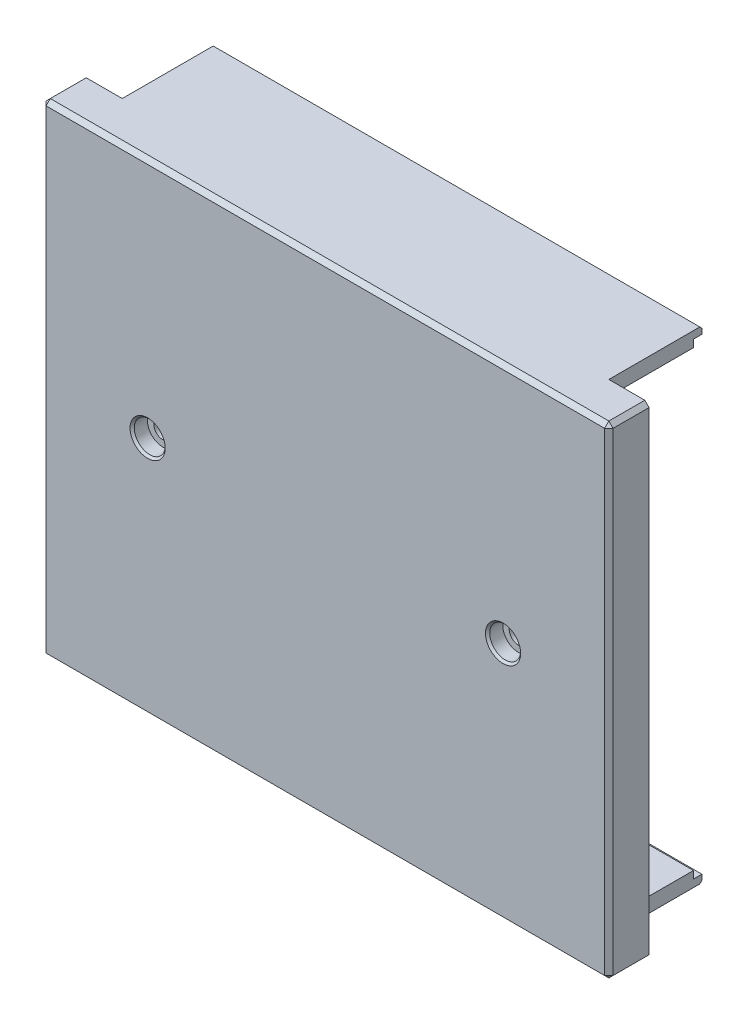
ISO-10303-21;
HEADER;
FILE_DESCRIPTION(('STEP AP214'),'2;1');
FILE_NAME('part.step','',(''),(''),'','','');
FILE_SCHEMA(('AUTOMOTIVE_DESIGN { 1 0 10303 214 1 1 1 1 }'));
ENDSEC;
DATA;
#1=APPLICATION_CONTEXT('core data for automotive mechanical design processes');
#2=APPLICATION_PROTOCOL_DEFINITION('international standard','automotive_design',2000,#1);
#3=PRODUCT_CONTEXT('',#1,'mechanical');
#4=PRODUCT('Part','Part','',(#3));
#5=PRODUCT_RELATED_PRODUCT_CATEGORY('part','',(#4));
#6=PRODUCT_DEFINITION_FORMATION('','',#4);
#7=PRODUCT_DEFINITION_CONTEXT('part definition',#1,'design');
#8=PRODUCT_DEFINITION('design','',#6,#7);
#9=PRODUCT_DEFINITION_SHAPE('','',#8);
#10=(LENGTH_UNIT() NAMED_UNIT(*) SI_UNIT(.MILLI.,.METRE.));
#11=(NAMED_UNIT(*) PLANE_ANGLE_UNIT() SI_UNIT($,.RADIAN.));
#12=(NAMED_UNIT(*) SI_UNIT($,.STERADIAN.) SOLID_ANGLE_UNIT());
#13=UNCERTAINTY_MEASURE_WITH_UNIT(LENGTH_MEASURE(1.E-05),#10,'distance_accuracy_value','');
#14=(GEOMETRIC_REPRESENTATION_CONTEXT(3) GLOBAL_UNCERTAINTY_ASSIGNED_CONTEXT((#13)) GLOBAL_UNIT_ASSIGNED_CONTEXT((#10,
#11,#12)) REPRESENTATION_CONTEXT('',''));
#15=CARTESIAN_POINT('',(0.,0.,0.));
#16=DIRECTION('',(0.,0.,1.));
#17=DIRECTION('',(1.,0.,0.));
#18=AXIS2_PLACEMENT_3D('',#15,#16,#17);
#19=CARTESIAN_POINT('',(0.,0.,-20.));
#20=DIRECTION('',(0.,0.,1.));
#21=DIRECTION('',(1.,0.,0.));
#22=AXIS2_PLACEMENT_3D('',#19,#20,#21);
#23=PLANE('',#22);
#24=DIRECTION('',(1.,0.,0.));
#25=VECTOR('',#24,1.);
#26=CARTESIAN_POINT('',(124.5,1.74999999999998,-20.));
#27=LINE('',#26,#25);
#28=CARTESIAN_POINT('',(9.50000000000001,1.74999999999998,-20.));
#29=VERTEX_POINT('',#28);
#30=CARTESIAN_POINT('',(124.5,1.74999999999998,-20.));
#31=VERTEX_POINT('',#30);
#32=EDGE_CURVE('E222',#29,#31,#27,.T.);
#33=ORIENTED_EDGE('',*,*,#32,.F.);
#34=DIRECTION('',(0.,1.,0.));
#35=VECTOR('',#34,1.);
#36=CARTESIAN_POINT('',(9.50000000000001,0.,-20.));
#37=LINE('',#36,#35);
#38=CARTESIAN_POINT('',(9.50000000000001,3.49999999999998,-20.));
#39=VERTEX_POINT('',#38);
#40=EDGE_CURVE('E209',#29,#39,#37,.T.);
#41=ORIENTED_EDGE('',*,*,#40,.T.);
#42=DIRECTION('',(1.,0.,0.));
#43=VECTOR('',#42,1.);
#44=CARTESIAN_POINT('',(124.5,3.49999999999998,-20.));
#45=LINE('',#44,#43);
#46=CARTESIAN_POINT('',(124.5,3.49999999999998,-20.));
#47=VERTEX_POINT('',#46);
#48=EDGE_CURVE('E260',#39,#47,#45,.T.);
#49=ORIENTED_EDGE('',*,*,#48,.T.);
#50=DIRECTION('',(0.,-1.,0.));
#51=VECTOR('',#50,1.);
#52=CARTESIAN_POINT('',(124.5,0.,-20.));
#53=LINE('',#52,#51);
#54=EDGE_CURVE('E256',#47,#31,#53,.T.);
#55=ORIENTED_EDGE('',*,*,#54,.T.);
#56=EDGE_LOOP('',(#33,#41,#49,#55));
#57=FACE_BOUND('',#56,.T.);
#58=ADVANCED_FACE('F33',(#57),#23,.F.);
#59=CARTESIAN_POINT('',(109.,57.,-20.));
#60=DIRECTION('',(0.,0.,1.));
#61=DIRECTION('',(1.,0.,0.));
#62=AXIS2_PLACEMENT_3D('',#59,#60,#61);
#63=CYLINDRICAL_SURFACE('',#62,2.15);
#64=CARTESIAN_POINT('',(109.,57.,0.));
#65=DIRECTION('',(0.,0.,-1.));
#66=DIRECTION('',(-1.,0.,0.));
#67=AXIS2_PLACEMENT_3D('',#64,#65,#66);
#68=CIRCLE('',#67,2.15);
#69=CARTESIAN_POINT('',(106.85,57.,0.));
#70=VERTEX_POINT('',#69);
#71=EDGE_CURVE('E248',#70,#70,#68,.T.);
#72=ORIENTED_EDGE('',*,*,#71,.T.);
#73=EDGE_LOOP('',(#72));
#74=FACE_BOUND('',#73,.T.);
#75=CARTESIAN_POINT('',(109.,57.,5.9));
#76=DIRECTION('',(0.,0.,1.));
#77=DIRECTION('',(1.,0.,0.));
#78=AXIS2_PLACEMENT_3D('',#75,#76,#77);
#79=CIRCLE('',#78,2.15);
#80=CARTESIAN_POINT('',(111.15,57.,5.9));
#81=VERTEX_POINT('',#80);
#82=EDGE_CURVE('E252',#81,#81,#79,.F.);
#83=ORIENTED_EDGE('',*,*,#82,.F.);
#84=EDGE_LOOP('',(#83));
#85=FACE_BOUND('',#84,.T.);
#86=ADVANCED_FACE('F442',(#74,#85),#63,.F.);
#87=CARTESIAN_POINT('',(25.,57.,-20.));
#88=DIRECTION('',(0.,0.,1.));
#89=DIRECTION('',(1.,0.,0.));
#90=AXIS2_PLACEMENT_3D('',#87,#88,#89);
#91=CYLINDRICAL_SURFACE('',#90,2.15);
#92=CARTESIAN_POINT('',(25.,57.,0.));
#93=DIRECTION('',(0.,0.,-1.));
#94=DIRECTION('',(-1.,0.,0.));
#95=AXIS2_PLACEMENT_3D('',#92,#93,#94);
#96=CIRCLE('',#95,2.15);
#97=CARTESIAN_POINT('',(22.85,57.,0.));
#98=VERTEX_POINT('',#97);
#99=EDGE_CURVE('E251',#98,#98,#96,.T.);
#100=ORIENTED_EDGE('',*,*,#99,.T.);
#101=EDGE_LOOP('',(#100));
#102=FACE_BOUND('',#101,.T.);
#103=CARTESIAN_POINT('',(25.,57.,5.9));
#104=DIRECTION('',(0.,0.,1.));
#105=DIRECTION('',(1.,0.,0.));
#106=AXIS2_PLACEMENT_3D('',#103,#104,#105);
#107=CIRCLE('',#106,2.15);
#108=CARTESIAN_POINT('',(27.15,57.,5.9));
#109=VERTEX_POINT('',#108);
#110=EDGE_CURVE('E243',#109,#109,#107,.F.);
#111=ORIENTED_EDGE('',*,*,#110,.F.);
#112=EDGE_LOOP('',(#111));
#113=FACE_BOUND('',#112,.T.);
#114=ADVANCED_FACE('F450',(#102,#113),#91,.F.);
#115=CARTESIAN_POINT('',(0.,0.,0.));
#116=DIRECTION('',(0.,0.,-1.));
#117=DIRECTION('',(-1.,0.,0.));
#118=AXIS2_PLACEMENT_3D('',#115,#116,#117);
#119=PLANE('',#118);
#120=ORIENTED_EDGE('',*,*,#99,.F.);
#121=EDGE_LOOP('',(#120));
#122=FACE_BOUND('',#121,.T.);
#123=ORIENTED_EDGE('',*,*,#71,.F.);
#124=EDGE_LOOP('',(#123));
#125=FACE_BOUND('',#124,.T.);
#126=DIRECTION('',(1.,0.,0.));
#127=VECTOR('',#126,1.);
#128=CARTESIAN_POINT('',(0.,0.,0.));
#129=LINE('',#128,#127);
#130=CARTESIAN_POINT('',(1.,0.,0.));
#131=VERTEX_POINT('',#130);
#132=CARTESIAN_POINT('',(9.50000000000001,0.,0.));
#133=VERTEX_POINT('',#132);
#134=EDGE_CURVE('E306',#131,#133,#129,.T.);
#135=ORIENTED_EDGE('',*,*,#134,.F.);
#136=DIRECTION('',(0.707106781186548,-0.707106781186548,0.));
#137=VECTOR('',#136,1.);
#138=CARTESIAN_POINT('',(0.5,0.5,0.));
#139=LINE('',#138,#137);
#140=CARTESIAN_POINT('',(0.,1.,0.));
#141=VERTEX_POINT('',#140);
#142=EDGE_CURVE('E333',#131,#141,#139,.F.);
#143=ORIENTED_EDGE('',*,*,#142,.T.);
#144=DIRECTION('',(0.,-1.,0.));
#145=VECTOR('',#144,1.);
#146=CARTESIAN_POINT('',(0.,0.,0.));
#147=LINE('',#146,#145);
#148=CARTESIAN_POINT('',(0.,113.,0.));
#149=VERTEX_POINT('',#148);
#150=EDGE_CURVE('E302',#149,#141,#147,.T.);
#151=ORIENTED_EDGE('',*,*,#150,.F.);
#152=DIRECTION('',(-0.707106781186548,-0.707106781186548,0.));
#153=VECTOR('',#152,1.);
#154=CARTESIAN_POINT('',(-56.5,56.5,0.));
#155=LINE('',#154,#153);
#156=CARTESIAN_POINT('',(1.,114.,0.));
#157=VERTEX_POINT('',#156);
#158=EDGE_CURVE('E331',#149,#157,#155,.F.);
#159=ORIENTED_EDGE('',*,*,#158,.T.);
#160=DIRECTION('',(-1.,0.,0.));
#161=VECTOR('',#160,1.);
#162=CARTESIAN_POINT('',(0.,114.,0.));
#163=LINE('',#162,#161);
#164=CARTESIAN_POINT('',(9.50000000000001,114.,0.));
#165=VERTEX_POINT('',#164);
#166=EDGE_CURVE('E312',#165,#157,#163,.T.);
#167=ORIENTED_EDGE('',*,*,#166,.F.);
#168=DIRECTION('',(0.,1.,0.));
#169=VECTOR('',#168,1.);
#170=CARTESIAN_POINT('',(9.50000000000001,110.5,0.));
#171=LINE('',#170,#169);
#172=CARTESIAN_POINT('',(9.50000000000001,110.5,0.));
#173=VERTEX_POINT('',#172);
#174=EDGE_CURVE('E281',#173,#165,#171,.T.);
#175=ORIENTED_EDGE('',*,*,#174,.F.);
#176=DIRECTION('',(-1.,0.,0.));
#177=VECTOR('',#176,1.);
#178=CARTESIAN_POINT('',(124.5,110.5,0.));
#179=LINE('',#178,#177);
#180=CARTESIAN_POINT('',(124.5,110.5,0.));
#181=VERTEX_POINT('',#180);
#182=EDGE_CURVE('E288',#181,#173,#179,.T.);
#183=ORIENTED_EDGE('',*,*,#182,.F.);
#184=DIRECTION('',(0.,-1.,0.));
#185=VECTOR('',#184,1.);
#186=CARTESIAN_POINT('',(124.5,114.,0.));
#187=LINE('',#186,#185);
#188=CARTESIAN_POINT('',(124.5,114.,0.));
#189=VERTEX_POINT('',#188);
#190=EDGE_CURVE('E277',#189,#181,#187,.T.);
#191=ORIENTED_EDGE('',*,*,#190,.F.);
#192=CARTESIAN_POINT('',(133.,114.,0.));
#193=VERTEX_POINT('',#192);
#194=EDGE_CURVE('E313',#193,#189,#163,.T.);
#195=ORIENTED_EDGE('',*,*,#194,.F.);
#196=DIRECTION('',(-0.707106781186548,0.707106781186548,0.));
#197=VECTOR('',#196,1.);
#198=CARTESIAN_POINT('',(123.5,123.5,0.));
#199=LINE('',#198,#197);
#200=CARTESIAN_POINT('',(134.,113.,0.));
#201=VERTEX_POINT('',#200);
#202=EDGE_CURVE('E329',#193,#201,#199,.F.);
#203=ORIENTED_EDGE('',*,*,#202,.T.);
#204=DIRECTION('',(0.,1.,0.));
#205=VECTOR('',#204,1.);
#206=CARTESIAN_POINT('',(134.,0.,0.));
#207=LINE('',#206,#205);
#208=CARTESIAN_POINT('',(134.,1.,0.));
#209=VERTEX_POINT('',#208);
#210=EDGE_CURVE('E309',#209,#201,#207,.T.);
#211=ORIENTED_EDGE('',*,*,#210,.F.);
#212=DIRECTION('',(0.707106781186548,0.707106781186548,0.));
#213=VECTOR('',#212,1.);
#214=CARTESIAN_POINT('',(66.5,-66.5,0.));
#215=LINE('',#214,#213);
#216=CARTESIAN_POINT('',(133.,0.,0.));
#217=VERTEX_POINT('',#216);
#218=EDGE_CURVE('E327',#209,#217,#215,.F.);
#219=ORIENTED_EDGE('',*,*,#218,.T.);
#220=CARTESIAN_POINT('',(124.5,0.,0.));
#221=VERTEX_POINT('',#220);
#222=EDGE_CURVE('E305',#221,#217,#129,.T.);
#223=ORIENTED_EDGE('',*,*,#222,.F.);
#224=DIRECTION('',(0.,-1.,0.));
#225=VECTOR('',#224,1.);
#226=CARTESIAN_POINT('',(124.5,0.,0.));
#227=LINE('',#226,#225);
#228=CARTESIAN_POINT('',(124.5,3.49999999999998,0.));
#229=VERTEX_POINT('',#228);
#230=EDGE_CURVE('E255',#229,#221,#227,.T.);
#231=ORIENTED_EDGE('',*,*,#230,.F.);
#232=DIRECTION('',(1.,0.,0.));
#233=VECTOR('',#232,1.);
#234=CARTESIAN_POINT('',(124.5,3.49999999999998,0.));
#235=LINE('',#234,#233);
#236=CARTESIAN_POINT('',(9.50000000000001,3.49999999999998,0.));
#237=VERTEX_POINT('',#236);
#238=EDGE_CURVE('E258',#237,#229,#235,.T.);
#239=ORIENTED_EDGE('',*,*,#238,.F.);
#240=DIRECTION('',(0.,1.,0.));
#241=VECTOR('',#240,1.);
#242=CARTESIAN_POINT('',(9.50000000000001,0.,0.));
#243=LINE('',#242,#241);
#244=EDGE_CURVE('E265',#133,#237,#243,.T.);
#245=ORIENTED_EDGE('',*,*,#244,.F.);
#246=EDGE_LOOP('',(#135,#143,#151,#159,#167,#175,#183,#191,#195,#203,#211,#219,#223,#231,#239,#245));
#247=FACE_BOUND('',#246,.T.);
#248=ADVANCED_FACE('F482',(#122,#125,#247),#119,.T.);
#249=CARTESIAN_POINT('',(0.,0.,9.5));
#250=DIRECTION('',(1.,0.,0.));
#251=DIRECTION('',(0.,0.,-1.));
#252=AXIS2_PLACEMENT_3D('',#249,#250,#251);
#253=PLANE('',#252);
#254=ORIENTED_EDGE('',*,*,#150,.T.);
#255=DIRECTION('',(0.,0.,1.));
#256=VECTOR('',#255,1.);
#257=CARTESIAN_POINT('',(0.,1.,9.5));
#258=LINE('',#257,#256);
#259=CARTESIAN_POINT('',(0.,1.,8.5));
#260=VERTEX_POINT('',#259);
#261=EDGE_CURVE('E339',#141,#260,#258,.T.);
#262=ORIENTED_EDGE('',*,*,#261,.T.);
#263=DIRECTION('',(0.,1.,0.));
#264=VECTOR('',#263,1.);
#265=CARTESIAN_POINT('',(0.,0.,8.5));
#266=LINE('',#265,#264);
#267=CARTESIAN_POINT('',(0.,113.,8.5));
#268=VERTEX_POINT('',#267);
#269=EDGE_CURVE('E335',#260,#268,#266,.T.);
#270=ORIENTED_EDGE('',*,*,#269,.T.);
#271=DIRECTION('',(0.,0.,-1.));
#272=VECTOR('',#271,1.);
#273=CARTESIAN_POINT('',(0.,113.,9.5));
#274=LINE('',#273,#272);
#275=EDGE_CURVE('E337',#268,#149,#274,.T.);
#276=ORIENTED_EDGE('',*,*,#275,.T.);
#277=EDGE_LOOP('',(#254,#262,#270,#276));
#278=FACE_BOUND('',#277,.T.);
#279=ADVANCED_FACE('F485',(#278),#253,.F.);
#280=CARTESIAN_POINT('',(0.,0.,9.5));
#281=DIRECTION('',(0.,1.,0.));
#282=DIRECTION('',(0.,0.,1.));
#283=AXIS2_PLACEMENT_3D('',#280,#281,#282);
#284=PLANE('',#283);
#285=DIRECTION('',(0.,0.,1.));
#286=VECTOR('',#285,1.);
#287=CARTESIAN_POINT('',(9.50000000000001,0.,-20.));
#288=LINE('',#287,#286);
#289=CARTESIAN_POINT('',(9.50000000000001,0.,-21.5000000000001));
#290=VERTEX_POINT('',#289);
#291=EDGE_CURVE('E273',#290,#133,#288,.T.);
#292=ORIENTED_EDGE('',*,*,#291,.F.);
#293=DIRECTION('',(1.,0.,0.));
#294=VECTOR('',#293,1.);
#295=CARTESIAN_POINT('',(0.,0.,-21.5000000000001));
#296=LINE('',#295,#294);
#297=CARTESIAN_POINT('',(124.5,0.,-21.5000000000001));
#298=VERTEX_POINT('',#297);
#299=EDGE_CURVE('E411',#290,#298,#296,.T.);
#300=ORIENTED_EDGE('',*,*,#299,.T.);
#301=DIRECTION('',(0.,0.,1.));
#302=VECTOR('',#301,1.);
#303=CARTESIAN_POINT('',(124.5,0.,-20.));
#304=LINE('',#303,#302);
#305=EDGE_CURVE('E275',#298,#221,#304,.T.);
#306=ORIENTED_EDGE('',*,*,#305,.T.);
#307=ORIENTED_EDGE('',*,*,#222,.T.);
#308=DIRECTION('',(0.,0.,1.));
#309=VECTOR('',#308,1.);
#310=CARTESIAN_POINT('',(133.,0.,9.5));
#311=LINE('',#310,#309);
#312=CARTESIAN_POINT('',(133.,0.,8.5));
#313=VERTEX_POINT('',#312);
#314=EDGE_CURVE('E322',#217,#313,#311,.T.);
#315=ORIENTED_EDGE('',*,*,#314,.T.);
#316=DIRECTION('',(-1.,0.,0.));
#317=VECTOR('',#316,1.);
#318=CARTESIAN_POINT('',(0.,0.,8.5));
#319=LINE('',#318,#317);
#320=CARTESIAN_POINT('',(1.,0.,8.5));
#321=VERTEX_POINT('',#320);
#322=EDGE_CURVE('E316',#313,#321,#319,.T.);
#323=ORIENTED_EDGE('',*,*,#322,.T.);
#324=DIRECTION('',(0.,0.,-1.));
#325=VECTOR('',#324,1.);
#326=CARTESIAN_POINT('',(1.,0.,9.5));
#327=LINE('',#326,#325);
#328=EDGE_CURVE('E324',#321,#131,#327,.T.);
#329=ORIENTED_EDGE('',*,*,#328,.T.);
#330=ORIENTED_EDGE('',*,*,#134,.T.);
#331=EDGE_LOOP('',(#292,#300,#306,#307,#315,#323,#329,#330));
#332=FACE_BOUND('',#331,.T.);
#333=ADVANCED_FACE('F492',(#332),#284,.F.);
#334=CARTESIAN_POINT('',(134.,0.,9.5));
#335=DIRECTION('',(-1.,0.,0.));
#336=DIRECTION('',(0.,0.,1.));
#337=AXIS2_PLACEMENT_3D('',#334,#335,#336);
#338=PLANE('',#337);
#339=ORIENTED_EDGE('',*,*,#210,.T.);
#340=DIRECTION('',(0.,0.,1.));
#341=VECTOR('',#340,1.);
#342=CARTESIAN_POINT('',(134.,113.,9.5));
#343=LINE('',#342,#341);
#344=CARTESIAN_POINT('',(134.,113.,8.5));
#345=VERTEX_POINT('',#344);
#346=EDGE_CURVE('E351',#201,#345,#343,.T.);
#347=ORIENTED_EDGE('',*,*,#346,.T.);
#348=DIRECTION('',(0.,-1.,0.));
#349=VECTOR('',#348,1.);
#350=CARTESIAN_POINT('',(134.,0.,8.5));
#351=LINE('',#350,#349);
#352=CARTESIAN_POINT('',(134.,1.,8.5));
#353=VERTEX_POINT('',#352);
#354=EDGE_CURVE('E347',#345,#353,#351,.T.);
#355=ORIENTED_EDGE('',*,*,#354,.T.);
#356=DIRECTION('',(0.,0.,-1.));
#357=VECTOR('',#356,1.);
#358=CARTESIAN_POINT('',(134.,1.,9.5));
#359=LINE('',#358,#357);
#360=EDGE_CURVE('E349',#353,#209,#359,.T.);
#361=ORIENTED_EDGE('',*,*,#360,.T.);
#362=EDGE_LOOP('',(#339,#347,#355,#361));
#363=FACE_BOUND('',#362,.T.);
#364=ADVANCED_FACE('F489',(#363),#338,.F.);
#365=CARTESIAN_POINT('',(0.,114.,9.5));
#366=DIRECTION('',(0.,-1.,0.));
#367=DIRECTION('',(0.,0.,-1.));
#368=AXIS2_PLACEMENT_3D('',#365,#366,#367);
#369=PLANE('',#368);
#370=DIRECTION('',(0.,0.,1.));
#371=VECTOR('',#370,1.);
#372=CARTESIAN_POINT('',(124.5,114.,-20.));
#373=LINE('',#372,#371);
#374=CARTESIAN_POINT('',(124.5,114.,-21.5));
#375=VERTEX_POINT('',#374);
#376=EDGE_CURVE('E300',#375,#189,#373,.T.);
#377=ORIENTED_EDGE('',*,*,#376,.F.);
#378=DIRECTION('',(-1.,0.,0.));
#379=VECTOR('',#378,1.);
#380=CARTESIAN_POINT('',(9.50000000000001,114.,-21.5));
#381=LINE('',#380,#379);
#382=CARTESIAN_POINT('',(9.50000000000002,114.,-21.5));
#383=VERTEX_POINT('',#382);
#384=EDGE_CURVE('E41',#375,#383,#381,.T.);
#385=ORIENTED_EDGE('',*,*,#384,.T.);
#386=DIRECTION('',(0.,0.,1.));
#387=VECTOR('',#386,1.);
#388=CARTESIAN_POINT('',(9.50000000000002,114.,-20.));
#389=LINE('',#388,#387);
#390=EDGE_CURVE('E285',#383,#165,#389,.T.);
#391=ORIENTED_EDGE('',*,*,#390,.T.);
#392=ORIENTED_EDGE('',*,*,#166,.T.);
#393=DIRECTION('',(0.,0.,1.));
#394=VECTOR('',#393,1.);
#395=CARTESIAN_POINT('',(1.,114.,9.5));
#396=LINE('',#395,#394);
#397=CARTESIAN_POINT('',(1.,114.,8.5));
#398=VERTEX_POINT('',#397);
#399=EDGE_CURVE('E345',#157,#398,#396,.T.);
#400=ORIENTED_EDGE('',*,*,#399,.T.);
#401=DIRECTION('',(1.,0.,0.));
#402=VECTOR('',#401,1.);
#403=CARTESIAN_POINT('',(0.,114.,8.5));
#404=LINE('',#403,#402);
#405=CARTESIAN_POINT('',(133.,114.,8.5));
#406=VERTEX_POINT('',#405);
#407=EDGE_CURVE('E341',#398,#406,#404,.T.);
#408=ORIENTED_EDGE('',*,*,#407,.T.);
#409=DIRECTION('',(0.,0.,-1.));
#410=VECTOR('',#409,1.);
#411=CARTESIAN_POINT('',(133.,114.,9.5));
#412=LINE('',#411,#410);
#413=EDGE_CURVE('E343',#406,#193,#412,.T.);
#414=ORIENTED_EDGE('',*,*,#413,.T.);
#415=ORIENTED_EDGE('',*,*,#194,.T.);
#416=EDGE_LOOP('',(#377,#385,#391,#392,#400,#408,#414,#415));
#417=FACE_BOUND('',#416,.T.);
#418=ADVANCED_FACE('F480',(#417),#369,.F.);
#419=CARTESIAN_POINT('',(0.,0.,9.5));
#420=DIRECTION('',(0.,0.,-1.));
#421=DIRECTION('',(-1.,0.,0.));
#422=AXIS2_PLACEMENT_3D('',#419,#420,#421);
#423=PLANE('',#422);
#424=CARTESIAN_POINT('',(109.,57.,9.5));
#425=DIRECTION('',(0.,0.,-1.));
#426=DIRECTION('',(-1.,0.,0.));
#427=AXIS2_PLACEMENT_3D('',#424,#425,#426);
#428=CIRCLE('',#427,4.15000000000001);
#429=CARTESIAN_POINT('',(104.85,57.,9.5));
#430=VERTEX_POINT('',#429);
#431=EDGE_CURVE('E402',#430,#430,#428,.T.);
#432=ORIENTED_EDGE('',*,*,#431,.T.);
#433=EDGE_LOOP('',(#432));
#434=FACE_BOUND('',#433,.T.);
#435=CARTESIAN_POINT('',(25.,57.,9.5));
#436=DIRECTION('',(0.,0.,-1.));
#437=DIRECTION('',(-1.,0.,0.));
#438=AXIS2_PLACEMENT_3D('',#435,#436,#437);
#439=CIRCLE('',#438,4.15000000000001);
#440=CARTESIAN_POINT('',(20.85,57.,9.5));
#441=VERTEX_POINT('',#440);
#442=EDGE_CURVE('E399',#441,#441,#439,.T.);
#443=ORIENTED_EDGE('',*,*,#442,.T.);
#444=EDGE_LOOP('',(#443));
#445=FACE_BOUND('',#444,.T.);
#446=DIRECTION('',(1.,0.,0.));
#447=VECTOR('',#446,1.);
#448=CARTESIAN_POINT('',(0.,1.,9.5));
#449=LINE('',#448,#447);
#450=CARTESIAN_POINT('',(1.,1.,9.5));
#451=VERTEX_POINT('',#450);
#452=CARTESIAN_POINT('',(133.,1.,9.5));
#453=VERTEX_POINT('',#452);
#454=EDGE_CURVE('E357',#451,#453,#449,.T.);
#455=ORIENTED_EDGE('',*,*,#454,.T.);
#456=DIRECTION('',(0.,1.,0.));
#457=VECTOR('',#456,1.);
#458=CARTESIAN_POINT('',(133.,0.,9.5));
#459=LINE('',#458,#457);
#460=CARTESIAN_POINT('',(133.,113.,9.5));
#461=VERTEX_POINT('',#460);
#462=EDGE_CURVE('E359',#453,#461,#459,.T.);
#463=ORIENTED_EDGE('',*,*,#462,.T.);
#464=DIRECTION('',(-1.,0.,0.));
#465=VECTOR('',#464,1.);
#466=CARTESIAN_POINT('',(0.,113.,9.5));
#467=LINE('',#466,#465);
#468=CARTESIAN_POINT('',(1.,113.,9.5));
#469=VERTEX_POINT('',#468);
#470=EDGE_CURVE('E353',#461,#469,#467,.T.);
#471=ORIENTED_EDGE('',*,*,#470,.T.);
#472=DIRECTION('',(0.,-1.,0.));
#473=VECTOR('',#472,1.);
#474=CARTESIAN_POINT('',(1.,0.,9.5));
#475=LINE('',#474,#473);
#476=EDGE_CURVE('E355',#469,#451,#475,.T.);
#477=ORIENTED_EDGE('',*,*,#476,.T.);
#478=EDGE_LOOP('',(#455,#463,#471,#477));
#479=FACE_BOUND('',#478,.T.);
#480=ADVANCED_FACE('F477',(#434,#445,#479),#423,.F.);
#481=CARTESIAN_POINT('',(124.5,114.,-20.));
#482=DIRECTION('',(-1.,0.,0.));
#483=DIRECTION('',(0.,0.,1.));
#484=AXIS2_PLACEMENT_3D('',#481,#482,#483);
#485=PLANE('',#484);
#486=DIRECTION('',(0.,-1.,0.));
#487=VECTOR('',#486,1.);
#488=CARTESIAN_POINT('',(124.5,114.,-22.));
#489=LINE('',#488,#487);
#490=CARTESIAN_POINT('',(124.5,113.5,-22.));
#491=VERTEX_POINT('',#490);
#492=CARTESIAN_POINT('',(124.5,112.25,-22.));
#493=VERTEX_POINT('',#492);
#494=EDGE_CURVE('E224',#491,#493,#489,.T.);
#495=ORIENTED_EDGE('',*,*,#494,.F.);
#496=DIRECTION('',(0.,0.707106781186567,0.707106781186528));
#497=VECTOR('',#496,1.);
#498=CARTESIAN_POINT('',(124.5,113.5,-22.));
#499=LINE('',#498,#497);
#500=EDGE_CURVE('E55',#491,#375,#499,.T.);
#501=ORIENTED_EDGE('',*,*,#500,.T.);
#502=ORIENTED_EDGE('',*,*,#376,.T.);
#503=ORIENTED_EDGE('',*,*,#190,.T.);
#504=DIRECTION('',(0.,0.,1.));
#505=VECTOR('',#504,1.);
#506=CARTESIAN_POINT('',(124.5,110.5,-20.));
#507=LINE('',#506,#505);
#508=CARTESIAN_POINT('',(124.5,110.5,-20.));
#509=VERTEX_POINT('',#508);
#510=EDGE_CURVE('E297',#509,#181,#507,.T.);
#511=ORIENTED_EDGE('',*,*,#510,.F.);
#512=DIRECTION('',(0.,-1.,0.));
#513=VECTOR('',#512,1.);
#514=CARTESIAN_POINT('',(124.5,114.,-20.));
#515=LINE('',#514,#513);
#516=CARTESIAN_POINT('',(124.5,112.25,-20.));
#517=VERTEX_POINT('',#516);
#518=EDGE_CURVE('E278',#517,#509,#515,.T.);
#519=ORIENTED_EDGE('',*,*,#518,.F.);
#520=DIRECTION('',(0.,0.,1.));
#521=VECTOR('',#520,1.);
#522=CARTESIAN_POINT('',(124.5,112.25,-22.));
#523=LINE('',#522,#521);
#524=EDGE_CURVE('E236',#493,#517,#523,.T.);
#525=ORIENTED_EDGE('',*,*,#524,.F.);
#526=EDGE_LOOP('',(#495,#501,#502,#503,#511,#519,#525));
#527=FACE_BOUND('',#526,.T.);
#528=ADVANCED_FACE('F426',(#527),#485,.F.);
#529=CARTESIAN_POINT('',(124.5,110.5,-20.));
#530=DIRECTION('',(0.,1.,0.));
#531=DIRECTION('',(0.,0.,1.));
#532=AXIS2_PLACEMENT_3D('',#529,#530,#531);
#533=PLANE('',#532);
#534=ORIENTED_EDGE('',*,*,#182,.T.);
#535=DIRECTION('',(0.,0.,1.));
#536=VECTOR('',#535,1.);
#537=CARTESIAN_POINT('',(9.50000000000001,110.5,-20.));
#538=LINE('',#537,#536);
#539=CARTESIAN_POINT('',(9.50000000000001,110.5,-20.));
#540=VERTEX_POINT('',#539);
#541=EDGE_CURVE('E294',#540,#173,#538,.T.);
#542=ORIENTED_EDGE('',*,*,#541,.F.);
#543=DIRECTION('',(-1.,0.,0.));
#544=VECTOR('',#543,1.);
#545=CARTESIAN_POINT('',(124.5,110.5,-20.));
#546=LINE('',#545,#544);
#547=EDGE_CURVE('E280',#509,#540,#546,.T.);
#548=ORIENTED_EDGE('',*,*,#547,.F.);
#549=ORIENTED_EDGE('',*,*,#510,.T.);
#550=EDGE_LOOP('',(#534,#542,#548,#549));
#551=FACE_BOUND('',#550,.T.);
#552=ADVANCED_FACE('F471',(#551),#533,.F.);
#553=CARTESIAN_POINT('',(9.50000000000001,110.5,-20.));
#554=DIRECTION('',(1.,0.,0.));
#555=DIRECTION('',(0.,1.,0.));
#556=AXIS2_PLACEMENT_3D('',#553,#554,#555);
#557=PLANE('',#556);
#558=ORIENTED_EDGE('',*,*,#390,.F.);
#559=DIRECTION('',(0.,-0.707106781186567,-0.707106781186528));
#560=VECTOR('',#559,1.);
#561=CARTESIAN_POINT('',(9.50000000000001,113.5,-22.));
#562=LINE('',#561,#560);
#563=CARTESIAN_POINT('',(9.50000000000001,113.5,-22.));
#564=VERTEX_POINT('',#563);
#565=EDGE_CURVE('E11',#383,#564,#562,.T.);
#566=ORIENTED_EDGE('',*,*,#565,.T.);
#567=DIRECTION('',(0.,1.,0.));
#568=VECTOR('',#567,1.);
#569=CARTESIAN_POINT('',(9.50000000000001,114.,-22.));
#570=LINE('',#569,#568);
#571=CARTESIAN_POINT('',(9.50000000000001,112.25,-22.));
#572=VERTEX_POINT('',#571);
#573=EDGE_CURVE('E228',#572,#564,#570,.T.);
#574=ORIENTED_EDGE('',*,*,#573,.F.);
#575=DIRECTION('',(0.,0.,1.));
#576=VECTOR('',#575,1.);
#577=CARTESIAN_POINT('',(9.50000000000001,112.25,-22.));
#578=LINE('',#577,#576);
#579=CARTESIAN_POINT('',(9.50000000000001,112.25,-20.));
#580=VERTEX_POINT('',#579);
#581=EDGE_CURVE('E231',#572,#580,#578,.T.);
#582=ORIENTED_EDGE('',*,*,#581,.T.);
#583=DIRECTION('',(0.,1.,0.));
#584=VECTOR('',#583,1.);
#585=CARTESIAN_POINT('',(9.50000000000001,110.5,-20.));
#586=LINE('',#585,#584);
#587=EDGE_CURVE('E283',#540,#580,#586,.T.);
#588=ORIENTED_EDGE('',*,*,#587,.F.);
#589=ORIENTED_EDGE('',*,*,#541,.T.);
#590=ORIENTED_EDGE('',*,*,#174,.T.);
#591=EDGE_LOOP('',(#558,#566,#574,#582,#588,#589,#590));
#592=FACE_BOUND('',#591,.T.);
#593=ADVANCED_FACE('F434',(#592),#557,.F.);
#594=CARTESIAN_POINT('',(0.,0.,-20.));
#595=DIRECTION('',(0.,0.,-1.));
#596=DIRECTION('',(-1.,0.,0.));
#597=AXIS2_PLACEMENT_3D('',#594,#595,#596);
#598=PLANE('',#597);
#599=DIRECTION('',(-1.,0.,0.));
#600=VECTOR('',#599,1.);
#601=CARTESIAN_POINT('',(124.5,112.25,-20.));
#602=LINE('',#601,#600);
#603=EDGE_CURVE('E212',#517,#580,#602,.T.);
#604=ORIENTED_EDGE('',*,*,#603,.F.);
#605=ORIENTED_EDGE('',*,*,#518,.T.);
#606=ORIENTED_EDGE('',*,*,#547,.T.);
#607=ORIENTED_EDGE('',*,*,#587,.T.);
#608=EDGE_LOOP('',(#604,#605,#606,#607));
#609=FACE_BOUND('',#608,.T.);
#610=ADVANCED_FACE('F465',(#609),#598,.T.);
#611=CARTESIAN_POINT('',(124.5,0.,-20.));
#612=DIRECTION('',(-1.,0.,0.));
#613=DIRECTION('',(0.,0.,1.));
#614=AXIS2_PLACEMENT_3D('',#611,#612,#613);
#615=PLANE('',#614);
#616=ORIENTED_EDGE('',*,*,#305,.F.);
#617=DIRECTION('',(0.,-0.707106781186567,0.707106781186528));
#618=VECTOR('',#617,1.);
#619=CARTESIAN_POINT('',(124.5,0.499999999999973,-22.));
#620=LINE('',#619,#618);
#621=CARTESIAN_POINT('',(124.5,0.499999999999973,-22.));
#622=VERTEX_POINT('',#621);
#623=EDGE_CURVE('E413',#298,#622,#620,.F.);
#624=ORIENTED_EDGE('',*,*,#623,.T.);
#625=DIRECTION('',(0.,-1.,0.));
#626=VECTOR('',#625,1.);
#627=CARTESIAN_POINT('',(124.5,0.,-22.));
#628=LINE('',#627,#626);
#629=CARTESIAN_POINT('',(124.5,1.74999999999998,-22.));
#630=VERTEX_POINT('',#629);
#631=EDGE_CURVE('E202',#630,#622,#628,.T.);
#632=ORIENTED_EDGE('',*,*,#631,.F.);
#633=DIRECTION('',(0.,0.,1.));
#634=VECTOR('',#633,1.);
#635=CARTESIAN_POINT('',(124.5,1.74999999999998,-22.));
#636=LINE('',#635,#634);
#637=EDGE_CURVE('E213',#630,#31,#636,.T.);
#638=ORIENTED_EDGE('',*,*,#637,.T.);
#639=ORIENTED_EDGE('',*,*,#54,.F.);
#640=DIRECTION('',(0.,0.,1.));
#641=VECTOR('',#640,1.);
#642=CARTESIAN_POINT('',(124.5,3.49999999999998,-20.));
#643=LINE('',#642,#641);
#644=EDGE_CURVE('E262',#47,#229,#643,.T.);
#645=ORIENTED_EDGE('',*,*,#644,.T.);
#646=ORIENTED_EDGE('',*,*,#230,.T.);
#647=EDGE_LOOP('',(#616,#624,#632,#638,#639,#645,#646));
#648=FACE_BOUND('',#647,.T.);
#649=ADVANCED_FACE('F462',(#648),#615,.F.);
#650=CARTESIAN_POINT('',(9.50000000000001,0.,-20.));
#651=DIRECTION('',(1.,0.,0.));
#652=DIRECTION('',(0.,1.,0.));
#653=AXIS2_PLACEMENT_3D('',#650,#651,#652);
#654=PLANE('',#653);
#655=DIRECTION('',(0.,1.,0.));
#656=VECTOR('',#655,1.);
#657=CARTESIAN_POINT('',(9.50000000000001,0.,-22.));
#658=LINE('',#657,#656);
#659=CARTESIAN_POINT('',(9.50000000000001,0.499999999999973,-22.));
#660=VERTEX_POINT('',#659);
#661=CARTESIAN_POINT('',(9.50000000000001,1.74999999999998,-22.));
#662=VERTEX_POINT('',#661);
#663=EDGE_CURVE('E192',#660,#662,#658,.T.);
#664=ORIENTED_EDGE('',*,*,#663,.F.);
#665=DIRECTION('',(0.,0.707106781186567,-0.707106781186528));
#666=VECTOR('',#665,1.);
#667=CARTESIAN_POINT('',(9.50000000000001,0.499999999999977,-22.));
#668=LINE('',#667,#666);
#669=EDGE_CURVE('E409',#660,#290,#668,.F.);
#670=ORIENTED_EDGE('',*,*,#669,.T.);
#671=ORIENTED_EDGE('',*,*,#291,.T.);
#672=ORIENTED_EDGE('',*,*,#244,.T.);
#673=DIRECTION('',(0.,0.,1.));
#674=VECTOR('',#673,1.);
#675=CARTESIAN_POINT('',(9.50000000000001,3.49999999999998,-20.));
#676=LINE('',#675,#674);
#677=EDGE_CURVE('E271',#39,#237,#676,.T.);
#678=ORIENTED_EDGE('',*,*,#677,.F.);
#679=ORIENTED_EDGE('',*,*,#40,.F.);
#680=DIRECTION('',(0.,0.,1.));
#681=VECTOR('',#680,1.);
#682=CARTESIAN_POINT('',(9.50000000000001,1.74999999999998,-22.));
#683=LINE('',#682,#681);
#684=EDGE_CURVE('E206',#662,#29,#683,.T.);
#685=ORIENTED_EDGE('',*,*,#684,.F.);
#686=EDGE_LOOP('',(#664,#670,#671,#672,#678,#679,#685));
#687=FACE_BOUND('',#686,.T.);
#688=ADVANCED_FACE('F207',(#687),#654,.F.);
#689=CARTESIAN_POINT('',(124.5,3.49999999999998,-20.));
#690=DIRECTION('',(0.,-1.,0.));
#691=DIRECTION('',(0.,0.,-1.));
#692=AXIS2_PLACEMENT_3D('',#689,#690,#691);
#693=PLANE('',#692);
#694=ORIENTED_EDGE('',*,*,#238,.T.);
#695=ORIENTED_EDGE('',*,*,#644,.F.);
#696=ORIENTED_EDGE('',*,*,#48,.F.);
#697=ORIENTED_EDGE('',*,*,#677,.T.);
#698=EDGE_LOOP('',(#694,#695,#696,#697));
#699=FACE_BOUND('',#698,.T.);
#700=ADVANCED_FACE('F455',(#699),#693,.F.);
#701=CARTESIAN_POINT('',(25.,57.,5.9));
#702=DIRECTION('',(0.,0.,1.));
#703=DIRECTION('',(1.,0.,0.));
#704=AXIS2_PLACEMENT_3D('',#701,#702,#703);
#705=PLANE('',#704);
#706=CARTESIAN_POINT('',(25.,57.,5.9));
#707=DIRECTION('',(0.,0.,1.));
#708=DIRECTION('',(1.,0.,0.));
#709=AXIS2_PLACEMENT_3D('',#706,#707,#708);
#710=CIRCLE('',#709,3.65);
#711=CARTESIAN_POINT('',(28.65,57.,5.9));
#712=VERTEX_POINT('',#711);
#713=EDGE_CURVE('E240',#712,#712,#710,.T.);
#714=ORIENTED_EDGE('',*,*,#713,.T.);
#715=EDGE_LOOP('',(#714));
#716=FACE_BOUND('',#715,.T.);
#717=ORIENTED_EDGE('',*,*,#110,.T.);
#718=EDGE_LOOP('',(#717));
#719=FACE_BOUND('',#718,.T.);
#720=ADVANCED_FACE('F458',(#716,#719),#705,.T.);
#721=CARTESIAN_POINT('',(25.,57.,5.9));
#722=DIRECTION('',(0.,0.,1.));
#723=DIRECTION('',(1.,0.,0.));
#724=AXIS2_PLACEMENT_3D('',#721,#722,#723);
#725=CYLINDRICAL_SURFACE('',#724,3.65);
#726=CARTESIAN_POINT('',(25.,57.,9.));
#727=DIRECTION('',(0.,0.,-1.));
#728=DIRECTION('',(-1.,0.,0.));
#729=AXIS2_PLACEMENT_3D('',#726,#727,#728);
#730=CIRCLE('',#729,3.65);
#731=CARTESIAN_POINT('',(21.35,57.,9.));
#732=VERTEX_POINT('',#731);
#733=EDGE_CURVE('E405',#732,#732,#730,.F.);
#734=ORIENTED_EDGE('',*,*,#733,.T.);
#735=EDGE_LOOP('',(#734));
#736=FACE_BOUND('',#735,.T.);
#737=ORIENTED_EDGE('',*,*,#713,.F.);
#738=EDGE_LOOP('',(#737));
#739=FACE_BOUND('',#738,.T.);
#740=ADVANCED_FACE('F564',(#736,#739),#725,.F.);
#741=CARTESIAN_POINT('',(109.,57.,5.9));
#742=DIRECTION('',(0.,0.,1.));
#743=DIRECTION('',(1.,0.,0.));
#744=AXIS2_PLACEMENT_3D('',#741,#742,#743);
#745=PLANE('',#744);
#746=CARTESIAN_POINT('',(109.,57.,5.9));
#747=DIRECTION('',(0.,0.,1.));
#748=DIRECTION('',(1.,0.,0.));
#749=AXIS2_PLACEMENT_3D('',#746,#747,#748);
#750=CIRCLE('',#749,3.65);
#751=CARTESIAN_POINT('',(112.65,57.,5.9));
#752=VERTEX_POINT('',#751);
#753=EDGE_CURVE('E244',#752,#752,#750,.T.);
#754=ORIENTED_EDGE('',*,*,#753,.T.);
#755=EDGE_LOOP('',(#754));
#756=FACE_BOUND('',#755,.T.);
#757=ORIENTED_EDGE('',*,*,#82,.T.);
#758=EDGE_LOOP('',(#757));
#759=FACE_BOUND('',#758,.T.);
#760=ADVANCED_FACE('F567',(#756,#759),#745,.T.);
#761=CARTESIAN_POINT('',(109.,57.,5.9));
#762=DIRECTION('',(0.,0.,1.));
#763=DIRECTION('',(1.,0.,0.));
#764=AXIS2_PLACEMENT_3D('',#761,#762,#763);
#765=CYLINDRICAL_SURFACE('',#764,3.65);
#766=CARTESIAN_POINT('',(109.,57.,9.));
#767=DIRECTION('',(0.,0.,-1.));
#768=DIRECTION('',(-1.,0.,0.));
#769=AXIS2_PLACEMENT_3D('',#766,#767,#768);
#770=CIRCLE('',#769,3.65);
#771=CARTESIAN_POINT('',(105.35,57.,9.));
#772=VERTEX_POINT('',#771);
#773=EDGE_CURVE('E362',#772,#772,#770,.F.);
#774=ORIENTED_EDGE('',*,*,#773,.T.);
#775=EDGE_LOOP('',(#774));
#776=FACE_BOUND('',#775,.T.);
#777=ORIENTED_EDGE('',*,*,#753,.F.);
#778=EDGE_LOOP('',(#777));
#779=FACE_BOUND('',#778,.T.);
#780=ADVANCED_FACE('F548',(#776,#779),#765,.F.);
#781=CARTESIAN_POINT('',(133.,114.,9.5));
#782=DIRECTION('',(-0.707106781186547,-0.707106781186547,0.));
#783=DIRECTION('',(0.,0.,-1.));
#784=AXIS2_PLACEMENT_3D('',#781,#782,#783);
#785=PLANE('',#784);
#786=DIRECTION('',(0.707106781186547,-0.707106781186547,0.));
#787=VECTOR('',#786,1.);
#788=CARTESIAN_POINT('',(134.,113.,8.5));
#789=LINE('',#788,#787);
#790=EDGE_CURVE('E247',#345,#406,#789,.F.);
#791=ORIENTED_EDGE('',*,*,#790,.F.);
#792=ORIENTED_EDGE('',*,*,#346,.F.);
#793=ORIENTED_EDGE('',*,*,#202,.F.);
#794=ORIENTED_EDGE('',*,*,#413,.F.);
#795=EDGE_LOOP('',(#791,#792,#793,#794));
#796=FACE_BOUND('',#795,.T.);
#797=ADVANCED_FACE('F544',(#796),#785,.F.);
#798=CARTESIAN_POINT('',(134.,113.,8.5));
#799=DIRECTION('',(0.577350269189626,0.577350269189626,0.577350269189626));
#800=DIRECTION('',(0.707106781186547,0.,-0.707106781186547));
#801=AXIS2_PLACEMENT_3D('',#798,#799,#800);
#802=PLANE('',#801);
#803=DIRECTION('',(-0.707106781186547,0.,0.707106781186547));
#804=VECTOR('',#803,1.);
#805=CARTESIAN_POINT('',(134.,113.,8.5));
#806=LINE('',#805,#804);
#807=EDGE_CURVE('E389',#345,#461,#806,.T.);
#808=ORIENTED_EDGE('',*,*,#807,.F.);
#809=ORIENTED_EDGE('',*,*,#790,.T.);
#810=DIRECTION('',(0.,0.707106781186547,-0.707106781186547));
#811=VECTOR('',#810,1.);
#812=CARTESIAN_POINT('',(133.,113.5,9.));
#813=LINE('',#812,#811);
#814=EDGE_CURVE('E392',#461,#406,#813,.T.);
#815=ORIENTED_EDGE('',*,*,#814,.F.);
#816=EDGE_LOOP('',(#808,#809,#815));
#817=FACE_BOUND('',#816,.T.);
#818=ADVANCED_FACE('F540',(#817),#802,.T.);
#819=CARTESIAN_POINT('',(0.,113.,9.5));
#820=DIRECTION('',(0.707106781186547,-0.707106781186547,0.));
#821=DIRECTION('',(0.,0.,-1.));
#822=AXIS2_PLACEMENT_3D('',#819,#820,#821);
#823=PLANE('',#822);
#824=ORIENTED_EDGE('',*,*,#158,.F.);
#825=ORIENTED_EDGE('',*,*,#275,.F.);
#826=DIRECTION('',(0.707106781186547,0.707106781186547,0.));
#827=VECTOR('',#826,1.);
#828=CARTESIAN_POINT('',(1.,114.,8.5));
#829=LINE('',#828,#827);
#830=EDGE_CURVE('E386',#398,#268,#829,.F.);
#831=ORIENTED_EDGE('',*,*,#830,.F.);
#832=ORIENTED_EDGE('',*,*,#399,.F.);
#833=EDGE_LOOP('',(#824,#825,#831,#832));
#834=FACE_BOUND('',#833,.T.);
#835=ADVANCED_FACE('F536',(#834),#823,.F.);
#836=CARTESIAN_POINT('',(0.,113.,9.5));
#837=DIRECTION('',(0.,-0.707106781186547,-0.707106781186547));
#838=DIRECTION('',(-1.,0.,0.));
#839=AXIS2_PLACEMENT_3D('',#836,#837,#838);
#840=PLANE('',#839);
#841=ORIENTED_EDGE('',*,*,#814,.T.);
#842=ORIENTED_EDGE('',*,*,#407,.F.);
#843=DIRECTION('',(0.,-0.707106781186547,0.707106781186547));
#844=VECTOR('',#843,1.);
#845=CARTESIAN_POINT('',(1.,114.,8.5));
#846=LINE('',#845,#844);
#847=EDGE_CURVE('E383',#469,#398,#846,.F.);
#848=ORIENTED_EDGE('',*,*,#847,.F.);
#849=ORIENTED_EDGE('',*,*,#470,.F.);
#850=EDGE_LOOP('',(#841,#842,#848,#849));
#851=FACE_BOUND('',#850,.T.);
#852=ADVANCED_FACE('F532',(#851),#840,.F.);
#853=CARTESIAN_POINT('',(133.,0.,9.5));
#854=DIRECTION('',(-0.707106781186547,0.,-0.707106781186547));
#855=DIRECTION('',(0.,1.,0.));
#856=AXIS2_PLACEMENT_3D('',#853,#854,#855);
#857=PLANE('',#856);
#858=ORIENTED_EDGE('',*,*,#807,.T.);
#859=ORIENTED_EDGE('',*,*,#462,.F.);
#860=DIRECTION('',(0.707106781186547,0.,-0.707106781186547));
#861=VECTOR('',#860,1.);
#862=CARTESIAN_POINT('',(133.5,1.,9.));
#863=LINE('',#862,#861);
#864=EDGE_CURVE('E380',#353,#453,#863,.F.);
#865=ORIENTED_EDGE('',*,*,#864,.F.);
#866=ORIENTED_EDGE('',*,*,#354,.F.);
#867=EDGE_LOOP('',(#858,#859,#865,#866));
#868=FACE_BOUND('',#867,.T.);
#869=ADVANCED_FACE('F528',(#868),#857,.F.);
#870=CARTESIAN_POINT('',(134.,1.,9.5));
#871=DIRECTION('',(-0.707106781186547,0.707106781186547,0.));
#872=DIRECTION('',(0.,0.,-1.));
#873=AXIS2_PLACEMENT_3D('',#870,#871,#872);
#874=PLANE('',#873);
#875=ORIENTED_EDGE('',*,*,#218,.F.);
#876=ORIENTED_EDGE('',*,*,#360,.F.);
#877=DIRECTION('',(-0.707106781186547,-0.707106781186547,0.));
#878=VECTOR('',#877,1.);
#879=CARTESIAN_POINT('',(133.,0.,8.5));
#880=LINE('',#879,#878);
#881=EDGE_CURVE('E377',#313,#353,#880,.F.);
#882=ORIENTED_EDGE('',*,*,#881,.F.);
#883=ORIENTED_EDGE('',*,*,#314,.F.);
#884=EDGE_LOOP('',(#875,#876,#882,#883));
#885=FACE_BOUND('',#884,.T.);
#886=ADVANCED_FACE('F524',(#885),#874,.F.);
#887=CARTESIAN_POINT('',(1.,114.,8.5));
#888=DIRECTION('',(-0.577350269189626,0.577350269189626,0.577350269189626));
#889=DIRECTION('',(0.707106781186547,0.,0.707106781186547));
#890=AXIS2_PLACEMENT_3D('',#887,#888,#889);
#891=PLANE('',#890);
#892=ORIENTED_EDGE('',*,*,#847,.T.);
#893=ORIENTED_EDGE('',*,*,#830,.T.);
#894=DIRECTION('',(-0.707106781186547,0.,-0.707106781186547));
#895=VECTOR('',#894,1.);
#896=CARTESIAN_POINT('',(0.5,113.,9.));
#897=LINE('',#896,#895);
#898=EDGE_CURVE('E374',#469,#268,#897,.T.);
#899=ORIENTED_EDGE('',*,*,#898,.F.);
#900=EDGE_LOOP('',(#892,#893,#899));
#901=FACE_BOUND('',#900,.T.);
#902=ADVANCED_FACE('F520',(#901),#891,.T.);
#903=CARTESIAN_POINT('',(133.,0.,8.5));
#904=DIRECTION('',(0.577350269189626,-0.577350269189626,0.577350269189626));
#905=DIRECTION('',(0.707106781186547,0.,-0.707106781186547));
#906=AXIS2_PLACEMENT_3D('',#903,#904,#905);
#907=PLANE('',#906);
#908=ORIENTED_EDGE('',*,*,#881,.T.);
#909=ORIENTED_EDGE('',*,*,#864,.T.);
#910=DIRECTION('',(0.,0.707106781186547,0.707106781186547));
#911=VECTOR('',#910,1.);
#912=CARTESIAN_POINT('',(133.,0.,8.5));
#913=LINE('',#912,#911);
#914=EDGE_CURVE('E371',#313,#453,#913,.T.);
#915=ORIENTED_EDGE('',*,*,#914,.F.);
#916=EDGE_LOOP('',(#908,#909,#915));
#917=FACE_BOUND('',#916,.T.);
#918=ADVANCED_FACE('F516',(#917),#907,.T.);
#919=CARTESIAN_POINT('',(1.,0.,9.5));
#920=DIRECTION('',(0.707106781186547,0.,-0.707106781186547));
#921=DIRECTION('',(0.,-1.,0.));
#922=AXIS2_PLACEMENT_3D('',#919,#920,#921);
#923=PLANE('',#922);
#924=ORIENTED_EDGE('',*,*,#898,.T.);
#925=ORIENTED_EDGE('',*,*,#269,.F.);
#926=DIRECTION('',(0.707106781186547,0.,0.707106781186547));
#927=VECTOR('',#926,1.);
#928=CARTESIAN_POINT('',(0.,1.,8.5));
#929=LINE('',#928,#927);
#930=EDGE_CURVE('E368',#451,#260,#929,.F.);
#931=ORIENTED_EDGE('',*,*,#930,.F.);
#932=ORIENTED_EDGE('',*,*,#476,.F.);
#933=EDGE_LOOP('',(#924,#925,#931,#932));
#934=FACE_BOUND('',#933,.T.);
#935=ADVANCED_FACE('F512',(#934),#923,.F.);
#936=CARTESIAN_POINT('',(0.,1.,9.5));
#937=DIRECTION('',(0.,0.707106781186547,-0.707106781186547));
#938=DIRECTION('',(1.,0.,0.));
#939=AXIS2_PLACEMENT_3D('',#936,#937,#938);
#940=PLANE('',#939);
#941=ORIENTED_EDGE('',*,*,#914,.T.);
#942=ORIENTED_EDGE('',*,*,#454,.F.);
#943=DIRECTION('',(0.,-0.707106781186547,-0.707106781186547));
#944=VECTOR('',#943,1.);
#945=CARTESIAN_POINT('',(1.,0.5,9.));
#946=LINE('',#945,#944);
#947=EDGE_CURVE('E365',#321,#451,#946,.F.);
#948=ORIENTED_EDGE('',*,*,#947,.F.);
#949=ORIENTED_EDGE('',*,*,#322,.F.);
#950=EDGE_LOOP('',(#941,#942,#948,#949));
#951=FACE_BOUND('',#950,.T.);
#952=ADVANCED_FACE('F508',(#951),#940,.F.);
#953=CARTESIAN_POINT('',(0.,1.,8.5));
#954=DIRECTION('',(-0.577350269189626,-0.577350269189626,0.577350269189626));
#955=DIRECTION('',(0.707106781186547,0.,0.707106781186547));
#956=AXIS2_PLACEMENT_3D('',#953,#954,#955);
#957=PLANE('',#956);
#958=ORIENTED_EDGE('',*,*,#947,.T.);
#959=ORIENTED_EDGE('',*,*,#930,.T.);
#960=DIRECTION('',(-0.707106781186547,0.707106781186547,0.));
#961=VECTOR('',#960,1.);
#962=CARTESIAN_POINT('',(0.,1.,8.5));
#963=LINE('',#962,#961);
#964=EDGE_CURVE('E239',#321,#260,#963,.T.);
#965=ORIENTED_EDGE('',*,*,#964,.F.);
#966=EDGE_LOOP('',(#958,#959,#965));
#967=FACE_BOUND('',#966,.T.);
#968=ADVANCED_FACE('F504',(#967),#957,.T.);
#969=CARTESIAN_POINT('',(1.,0.,9.5));
#970=DIRECTION('',(0.707106781186547,0.707106781186547,0.));
#971=DIRECTION('',(0.,0.,-1.));
#972=AXIS2_PLACEMENT_3D('',#969,#970,#971);
#973=PLANE('',#972);
#974=ORIENTED_EDGE('',*,*,#964,.T.);
#975=ORIENTED_EDGE('',*,*,#261,.F.);
#976=ORIENTED_EDGE('',*,*,#142,.F.);
#977=ORIENTED_EDGE('',*,*,#328,.F.);
#978=EDGE_LOOP('',(#974,#975,#976,#977));
#979=FACE_BOUND('',#978,.T.);
#980=ADVANCED_FACE('F500',(#979),#973,.F.);
#981=CARTESIAN_POINT('',(109.,57.,9.));
#982=DIRECTION('',(0.,0.,1.));
#983=DIRECTION('',(1.,0.,0.));
#984=AXIS2_PLACEMENT_3D('',#981,#982,#983);
#985=CONICAL_SURFACE('',#984,3.65,0.785398163397463);
#986=ORIENTED_EDGE('',*,*,#431,.F.);
#987=EDGE_LOOP('',(#986));
#988=FACE_BOUND('',#987,.T.);
#989=ORIENTED_EDGE('',*,*,#773,.F.);
#990=EDGE_LOOP('',(#989));
#991=FACE_BOUND('',#990,.T.);
#992=ADVANCED_FACE('F503',(#988,#991),#985,.F.);
#993=CARTESIAN_POINT('',(25.,57.,9.));
#994=DIRECTION('',(0.,0.,1.));
#995=DIRECTION('',(1.,0.,0.));
#996=AXIS2_PLACEMENT_3D('',#993,#994,#995);
#997=CONICAL_SURFACE('',#996,3.65,0.785398163397464);
#998=ORIENTED_EDGE('',*,*,#442,.F.);
#999=EDGE_LOOP('',(#998));
#1000=FACE_BOUND('',#999,.T.);
#1001=ORIENTED_EDGE('',*,*,#733,.F.);
#1002=EDGE_LOOP('',(#1001));
#1003=FACE_BOUND('',#1002,.T.);
#1004=ADVANCED_FACE('F552',(#1000,#1003),#997,.F.);
#1005=CARTESIAN_POINT('',(124.5,112.25,-22.));
#1006=DIRECTION('',(0.,1.,0.));
#1007=DIRECTION('',(0.,0.,1.));
#1008=AXIS2_PLACEMENT_3D('',#1005,#1006,#1007);
#1009=PLANE('',#1008);
#1010=ORIENTED_EDGE('',*,*,#603,.T.);
#1011=ORIENTED_EDGE('',*,*,#581,.F.);
#1012=DIRECTION('',(-1.,0.,0.));
#1013=VECTOR('',#1012,1.);
#1014=CARTESIAN_POINT('',(124.5,112.25,-22.));
#1015=LINE('',#1014,#1013);
#1016=EDGE_CURVE('E226',#493,#572,#1015,.T.);
#1017=ORIENTED_EDGE('',*,*,#1016,.F.);
#1018=ORIENTED_EDGE('',*,*,#524,.T.);
#1019=EDGE_LOOP('',(#1010,#1011,#1017,#1018));
#1020=FACE_BOUND('',#1019,.T.);
#1021=ADVANCED_FACE('F430',(#1020),#1009,.F.);
#1022=CARTESIAN_POINT('',(0.,0.,-22.));
#1023=DIRECTION('',(0.,0.,-1.));
#1024=DIRECTION('',(-1.,0.,0.));
#1025=AXIS2_PLACEMENT_3D('',#1022,#1023,#1024);
#1026=PLANE('',#1025);
#1027=ORIENTED_EDGE('',*,*,#573,.T.);
#1028=DIRECTION('',(1.,0.,0.));
#1029=VECTOR('',#1028,1.);
#1030=CARTESIAN_POINT('',(124.5,113.5,-22.));
#1031=LINE('',#1030,#1029);
#1032=EDGE_CURVE('E415',#564,#491,#1031,.T.);
#1033=ORIENTED_EDGE('',*,*,#1032,.T.);
#1034=ORIENTED_EDGE('',*,*,#494,.T.);
#1035=ORIENTED_EDGE('',*,*,#1016,.T.);
#1036=EDGE_LOOP('',(#1027,#1033,#1034,#1035));
#1037=FACE_BOUND('',#1036,.T.);
#1038=ADVANCED_FACE('F420',(#1037),#1026,.T.);
#1039=CARTESIAN_POINT('',(124.5,1.74999999999998,-22.));
#1040=DIRECTION('',(0.,-1.,0.));
#1041=DIRECTION('',(0.,0.,-1.));
#1042=AXIS2_PLACEMENT_3D('',#1039,#1040,#1041);
#1043=PLANE('',#1042);
#1044=ORIENTED_EDGE('',*,*,#32,.T.);
#1045=ORIENTED_EDGE('',*,*,#637,.F.);
#1046=DIRECTION('',(1.,0.,0.));
#1047=VECTOR('',#1046,1.);
#1048=CARTESIAN_POINT('',(124.5,1.74999999999998,-22.));
#1049=LINE('',#1048,#1047);
#1050=EDGE_CURVE('E197',#662,#630,#1049,.T.);
#1051=ORIENTED_EDGE('',*,*,#1050,.F.);
#1052=ORIENTED_EDGE('',*,*,#684,.T.);
#1053=EDGE_LOOP('',(#1044,#1045,#1051,#1052));
#1054=FACE_BOUND('',#1053,.T.);
#1055=ADVANCED_FACE('F215',(#1054),#1043,.F.);
#1056=CARTESIAN_POINT('',(0.,0.,-22.));
#1057=DIRECTION('',(0.,0.,1.));
#1058=DIRECTION('',(1.,0.,0.));
#1059=AXIS2_PLACEMENT_3D('',#1056,#1057,#1058);
#1060=PLANE('',#1059);
#1061=ORIENTED_EDGE('',*,*,#631,.T.);
#1062=DIRECTION('',(-1.,0.,0.));
#1063=VECTOR('',#1062,1.);
#1064=CARTESIAN_POINT('',(0.,0.499999999999973,-22.));
#1065=LINE('',#1064,#1063);
#1066=EDGE_CURVE('E200',#622,#660,#1065,.T.);
#1067=ORIENTED_EDGE('',*,*,#1066,.T.);
#1068=ORIENTED_EDGE('',*,*,#663,.T.);
#1069=ORIENTED_EDGE('',*,*,#1050,.T.);
#1070=EDGE_LOOP('',(#1061,#1067,#1068,#1069));
#1071=FACE_BOUND('',#1070,.T.);
#1072=ADVANCED_FACE('F195',(#1071),#1060,.F.);
#1073=CARTESIAN_POINT('',(0.,0.499999999999973,-22.));
#1074=DIRECTION('',(0.,0.707106781186528,0.707106781186567));
#1075=DIRECTION('',(-1.,0.,0.));
#1076=AXIS2_PLACEMENT_3D('',#1073,#1074,#1075);
#1077=PLANE('',#1076);
#1078=ORIENTED_EDGE('',*,*,#623,.F.);
#1079=ORIENTED_EDGE('',*,*,#299,.F.);
#1080=ORIENTED_EDGE('',*,*,#669,.F.);
#1081=ORIENTED_EDGE('',*,*,#1066,.F.);
#1082=EDGE_LOOP('',(#1078,#1079,#1080,#1081));
#1083=FACE_BOUND('',#1082,.T.);
#1084=ADVANCED_FACE('F436',(#1083),#1077,.F.);
#1085=CARTESIAN_POINT('',(0.,113.5,-22.));
#1086=DIRECTION('',(0.,0.707106781186528,-0.707106781186567));
#1087=DIRECTION('',(-1.,0.,0.));
#1088=AXIS2_PLACEMENT_3D('',#1085,#1086,#1087);
#1089=PLANE('',#1088);
#1090=ORIENTED_EDGE('',*,*,#565,.F.);
#1091=ORIENTED_EDGE('',*,*,#384,.F.);
#1092=ORIENTED_EDGE('',*,*,#500,.F.);
#1093=ORIENTED_EDGE('',*,*,#1032,.F.);
#1094=EDGE_LOOP('',(#1090,#1091,#1092,#1093));
#1095=FACE_BOUND('',#1094,.T.);
#1096=ADVANCED_FACE('F35',(#1095),#1089,.T.);
#1097=CLOSED_SHELL('',(#58,#86,#114,#248,#279,#333,#364,#418,#480,#528,#552,#593,#610,#649,#688,
#700,#720,#740,#760,#780,#797,#818,#835,#852,#869,#886,#902,#918,#935,#952,#968,#980,#992,#1004,
#1021,#1038,#1055,#1072,#1084,#1096));
#1098=MANIFOLD_SOLID_BREP('B2',#1097);
#1099=ADVANCED_BREP_SHAPE_REPRESENTATION('',(#18,#1098),#14);
#1100=SHAPE_DEFINITION_REPRESENTATION(#9,#1099);
ENDSEC;
END-ISO-10303-21;
